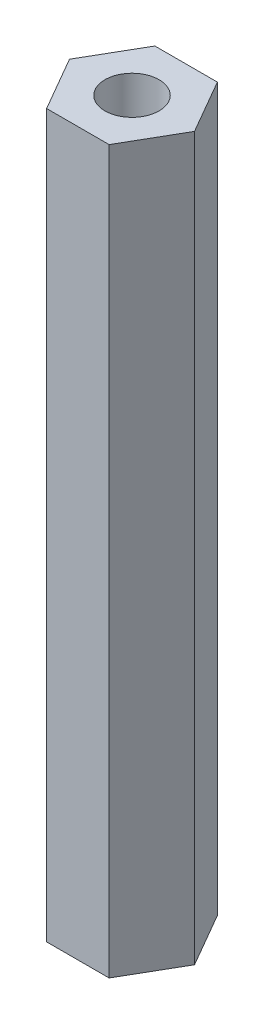
ISO-10303-21;
HEADER;
FILE_DESCRIPTION(('STEP AP214'),'2;1');
FILE_NAME('part.step','',(''),(''),'','','');
FILE_SCHEMA(('AUTOMOTIVE_DESIGN { 1 0 10303 214 1 1 1 1 }'));
ENDSEC;
DATA;
#1=APPLICATION_CONTEXT('core data for automotive mechanical design processes');
#2=APPLICATION_PROTOCOL_DEFINITION('international standard','automotive_design',2000,#1);
#3=PRODUCT_CONTEXT('',#1,'mechanical');
#4=PRODUCT('Part','Part','',(#3));
#5=PRODUCT_RELATED_PRODUCT_CATEGORY('part','',(#4));
#6=PRODUCT_DEFINITION_FORMATION('','',#4);
#7=PRODUCT_DEFINITION_CONTEXT('part definition',#1,'design');
#8=PRODUCT_DEFINITION('design','',#6,#7);
#9=PRODUCT_DEFINITION_SHAPE('','',#8);
#10=(LENGTH_UNIT() NAMED_UNIT(*) SI_UNIT(.MILLI.,.METRE.));
#11=(NAMED_UNIT(*) PLANE_ANGLE_UNIT() SI_UNIT($,.RADIAN.));
#12=(NAMED_UNIT(*) SI_UNIT($,.STERADIAN.) SOLID_ANGLE_UNIT());
#13=UNCERTAINTY_MEASURE_WITH_UNIT(LENGTH_MEASURE(1.E-05),#10,'distance_accuracy_value','');
#14=(GEOMETRIC_REPRESENTATION_CONTEXT(3) GLOBAL_UNCERTAINTY_ASSIGNED_CONTEXT((#13)) GLOBAL_UNIT_ASSIGNED_CONTEXT((#10,
#11,#12)) REPRESENTATION_CONTEXT('',''));
#15=CARTESIAN_POINT('',(0.,0.,0.));
#16=DIRECTION('',(0.,0.,1.));
#17=DIRECTION('',(1.,0.,0.));
#18=AXIS2_PLACEMENT_3D('',#15,#16,#17);
#19=CARTESIAN_POINT('',(1.73205080756888,20.,3.00000000000001));
#20=DIRECTION('',(-0.866025403784439,0.,-0.5));
#21=DIRECTION('',(-0.5,0.,0.866025403784439));
#22=AXIS2_PLACEMENT_3D('',#19,#20,#21);
#23=PLANE('',#22);
#24=DIRECTION('',(0.5,0.,-0.866025403784439));
#25=VECTOR('',#24,1.);
#26=CARTESIAN_POINT('',(1.73205080756888,-20.,3.00000000000001));
#27=LINE('',#26,#25);
#28=CARTESIAN_POINT('',(1.73205080756888,-20.,3.00000000000001));
#29=VERTEX_POINT('',#28);
#30=CARTESIAN_POINT('',(3.46410161513776,-20.,0.));
#31=VERTEX_POINT('',#30);
#32=EDGE_CURVE('E132',#29,#31,#27,.T.);
#33=ORIENTED_EDGE('',*,*,#32,.T.);
#34=DIRECTION('',(0.,-1.,0.));
#35=VECTOR('',#34,1.);
#36=CARTESIAN_POINT('',(3.46410161513776,20.,0.));
#37=LINE('',#36,#35);
#38=CARTESIAN_POINT('',(3.46410161513776,20.,0.));
#39=VERTEX_POINT('',#38);
#40=EDGE_CURVE('E11',#39,#31,#37,.T.);
#41=ORIENTED_EDGE('',*,*,#40,.F.);
#42=DIRECTION('',(0.5,0.,-0.866025403784439));
#43=VECTOR('',#42,1.);
#44=CARTESIAN_POINT('',(1.73205080756888,20.,3.00000000000001));
#45=LINE('',#44,#43);
#46=CARTESIAN_POINT('',(1.73205080756888,20.,3.00000000000001));
#47=VERTEX_POINT('',#46);
#48=EDGE_CURVE('E149',#47,#39,#45,.T.);
#49=ORIENTED_EDGE('',*,*,#48,.F.);
#50=DIRECTION('',(0.,-1.,0.));
#51=VECTOR('',#50,1.);
#52=CARTESIAN_POINT('',(1.73205080756888,20.,3.00000000000001));
#53=LINE('',#52,#51);
#54=EDGE_CURVE('E128',#47,#29,#53,.T.);
#55=ORIENTED_EDGE('',*,*,#54,.T.);
#56=EDGE_LOOP('',(#33,#41,#49,#55));
#57=FACE_BOUND('',#56,.T.);
#58=ADVANCED_FACE('F43',(#57),#23,.F.);
#59=CARTESIAN_POINT('',(3.46410161513776,20.,0.));
#60=DIRECTION('',(-0.866025403784439,0.,0.5));
#61=DIRECTION('',(0.5,0.,0.866025403784439));
#62=AXIS2_PLACEMENT_3D('',#59,#60,#61);
#63=PLANE('',#62);
#64=DIRECTION('',(-0.5,0.,-0.866025403784439));
#65=VECTOR('',#64,1.);
#66=CARTESIAN_POINT('',(3.46410161513776,-20.,0.));
#67=LINE('',#66,#65);
#68=CARTESIAN_POINT('',(1.73205080756886,-20.,-3.00000000000003));
#69=VERTEX_POINT('',#68);
#70=EDGE_CURVE('E136',#31,#69,#67,.T.);
#71=ORIENTED_EDGE('',*,*,#70,.T.);
#72=DIRECTION('',(0.,-1.,0.));
#73=VECTOR('',#72,1.);
#74=CARTESIAN_POINT('',(1.73205080756886,20.,-3.00000000000003));
#75=LINE('',#74,#73);
#76=CARTESIAN_POINT('',(1.73205080756886,20.,-3.00000000000003));
#77=VERTEX_POINT('',#76);
#78=EDGE_CURVE('E52',#77,#69,#75,.T.);
#79=ORIENTED_EDGE('',*,*,#78,.F.);
#80=DIRECTION('',(-0.5,0.,-0.866025403784439));
#81=VECTOR('',#80,1.);
#82=CARTESIAN_POINT('',(3.46410161513776,20.,0.));
#83=LINE('',#82,#81);
#84=EDGE_CURVE('E97',#39,#77,#83,.T.);
#85=ORIENTED_EDGE('',*,*,#84,.F.);
#86=ORIENTED_EDGE('',*,*,#40,.T.);
#87=EDGE_LOOP('',(#71,#79,#85,#86));
#88=FACE_BOUND('',#87,.T.);
#89=ADVANCED_FACE('F178',(#88),#63,.F.);
#90=CARTESIAN_POINT('',(1.73205080756886,20.,-3.00000000000003));
#91=DIRECTION('',(0.,0.,1.));
#92=DIRECTION('',(1.,0.,0.));
#93=AXIS2_PLACEMENT_3D('',#90,#91,#92);
#94=PLANE('',#93);
#95=DIRECTION('',(-1.,0.,0.));
#96=VECTOR('',#95,1.);
#97=CARTESIAN_POINT('',(1.73205080756886,-20.,-3.00000000000003));
#98=LINE('',#97,#96);
#99=CARTESIAN_POINT('',(-1.73205080756889,-20.,-3.00000000000003));
#100=VERTEX_POINT('',#99);
#101=EDGE_CURVE('E140',#69,#100,#98,.T.);
#102=ORIENTED_EDGE('',*,*,#101,.T.);
#103=DIRECTION('',(0.,-1.,0.));
#104=VECTOR('',#103,1.);
#105=CARTESIAN_POINT('',(-1.73205080756889,20.,-3.00000000000003));
#106=LINE('',#105,#104);
#107=CARTESIAN_POINT('',(-1.73205080756889,20.,-3.00000000000003));
#108=VERTEX_POINT('',#107);
#109=EDGE_CURVE('E121',#108,#100,#106,.T.);
#110=ORIENTED_EDGE('',*,*,#109,.F.);
#111=DIRECTION('',(-1.,0.,0.));
#112=VECTOR('',#111,1.);
#113=CARTESIAN_POINT('',(1.73205080756886,20.,-3.00000000000003));
#114=LINE('',#113,#112);
#115=EDGE_CURVE('E110',#77,#108,#114,.T.);
#116=ORIENTED_EDGE('',*,*,#115,.F.);
#117=ORIENTED_EDGE('',*,*,#78,.T.);
#118=EDGE_LOOP('',(#102,#110,#116,#117));
#119=FACE_BOUND('',#118,.T.);
#120=ADVANCED_FACE('F159',(#119),#94,.F.);
#121=CARTESIAN_POINT('',(-1.73205080756889,20.,-3.00000000000003));
#122=DIRECTION('',(0.866025403784439,0.,0.499999999999999));
#123=DIRECTION('',(0.499999999999999,0.,-0.866025403784439));
#124=AXIS2_PLACEMENT_3D('',#121,#122,#123);
#125=PLANE('',#124);
#126=DIRECTION('',(-0.499999999999999,0.,0.866025403784439));
#127=VECTOR('',#126,1.);
#128=CARTESIAN_POINT('',(-1.73205080756889,-20.,-3.00000000000003));
#129=LINE('',#128,#127);
#130=CARTESIAN_POINT('',(-3.46410161513777,-20.,0.));
#131=VERTEX_POINT('',#130);
#132=EDGE_CURVE('E119',#100,#131,#129,.T.);
#133=ORIENTED_EDGE('',*,*,#132,.T.);
#134=DIRECTION('',(0.,-1.,0.));
#135=VECTOR('',#134,1.);
#136=CARTESIAN_POINT('',(-3.46410161513777,20.,0.));
#137=LINE('',#136,#135);
#138=CARTESIAN_POINT('',(-3.46410161513777,20.,0.));
#139=VERTEX_POINT('',#138);
#140=EDGE_CURVE('E116',#139,#131,#137,.T.);
#141=ORIENTED_EDGE('',*,*,#140,.F.);
#142=DIRECTION('',(-0.499999999999999,0.,0.866025403784439));
#143=VECTOR('',#142,1.);
#144=CARTESIAN_POINT('',(-1.73205080756889,20.,-3.00000000000003));
#145=LINE('',#144,#143);
#146=EDGE_CURVE('E104',#108,#139,#145,.T.);
#147=ORIENTED_EDGE('',*,*,#146,.F.);
#148=ORIENTED_EDGE('',*,*,#109,.T.);
#149=EDGE_LOOP('',(#133,#141,#147,#148));
#150=FACE_BOUND('',#149,.T.);
#151=ADVANCED_FACE('F117',(#150),#125,.F.);
#152=CARTESIAN_POINT('',(-3.46410161513777,20.,0.));
#153=DIRECTION('',(0.86602540378444,0.,-0.499999999999998));
#154=DIRECTION('',(-0.499999999999998,0.,-0.86602540378444));
#155=AXIS2_PLACEMENT_3D('',#152,#153,#154);
#156=PLANE('',#155);
#157=DIRECTION('',(0.499999999999998,0.,0.86602540378444));
#158=VECTOR('',#157,1.);
#159=CARTESIAN_POINT('',(-3.46410161513777,-20.,0.));
#160=LINE('',#159,#158);
#161=CARTESIAN_POINT('',(-1.73205080756889,-20.,3.00000000000002));
#162=VERTEX_POINT('',#161);
#163=EDGE_CURVE('E83',#131,#162,#160,.T.);
#164=ORIENTED_EDGE('',*,*,#163,.T.);
#165=DIRECTION('',(0.,-1.,0.));
#166=VECTOR('',#165,1.);
#167=CARTESIAN_POINT('',(-1.73205080756889,20.,3.00000000000002));
#168=LINE('',#167,#166);
#169=CARTESIAN_POINT('',(-1.73205080756889,20.,3.00000000000002));
#170=VERTEX_POINT('',#169);
#171=EDGE_CURVE('E122',#170,#162,#168,.T.);
#172=ORIENTED_EDGE('',*,*,#171,.F.);
#173=DIRECTION('',(0.499999999999998,0.,0.86602540378444));
#174=VECTOR('',#173,1.);
#175=CARTESIAN_POINT('',(-3.46410161513777,20.,0.));
#176=LINE('',#175,#174);
#177=EDGE_CURVE('E108',#139,#170,#176,.T.);
#178=ORIENTED_EDGE('',*,*,#177,.F.);
#179=ORIENTED_EDGE('',*,*,#140,.T.);
#180=EDGE_LOOP('',(#164,#172,#178,#179));
#181=FACE_BOUND('',#180,.T.);
#182=ADVANCED_FACE('F124',(#181),#156,.F.);
#183=CARTESIAN_POINT('',(-1.73205080756889,20.,3.00000000000002));
#184=DIRECTION('',(0.,0.,-1.));
#185=DIRECTION('',(-1.,0.,0.));
#186=AXIS2_PLACEMENT_3D('',#183,#184,#185);
#187=PLANE('',#186);
#188=DIRECTION('',(1.,0.,0.));
#189=VECTOR('',#188,1.);
#190=CARTESIAN_POINT('',(-1.73205080756889,-20.,3.00000000000002));
#191=LINE('',#190,#189);
#192=EDGE_CURVE('E89',#162,#29,#191,.T.);
#193=ORIENTED_EDGE('',*,*,#192,.T.);
#194=ORIENTED_EDGE('',*,*,#54,.F.);
#195=DIRECTION('',(1.,0.,0.));
#196=VECTOR('',#195,1.);
#197=CARTESIAN_POINT('',(-1.73205080756889,20.,3.00000000000002));
#198=LINE('',#197,#196);
#199=EDGE_CURVE('E60',#170,#47,#198,.T.);
#200=ORIENTED_EDGE('',*,*,#199,.F.);
#201=ORIENTED_EDGE('',*,*,#171,.T.);
#202=EDGE_LOOP('',(#193,#194,#200,#201));
#203=FACE_BOUND('',#202,.T.);
#204=ADVANCED_FACE('F166',(#203),#187,.F.);
#205=CARTESIAN_POINT('',(0.,20.,0.));
#206=DIRECTION('',(0.,1.,0.));
#207=DIRECTION('',(0.,0.,1.));
#208=AXIS2_PLACEMENT_3D('',#205,#206,#207);
#209=PLANE('',#208);
#210=CARTESIAN_POINT('',(0.,20.,0.));
#211=DIRECTION('',(0.,1.,0.));
#212=DIRECTION('',(0.,0.,1.));
#213=AXIS2_PLACEMENT_3D('',#210,#211,#212);
#214=CIRCLE('',#213,1.5);
#215=CARTESIAN_POINT('',(0.,20.,1.5));
#216=VERTEX_POINT('',#215);
#217=EDGE_CURVE('E300',#216,#216,#214,.T.);
#218=ORIENTED_EDGE('',*,*,#217,.F.);
#219=EDGE_LOOP('',(#218));
#220=FACE_BOUND('',#219,.T.);
#221=ORIENTED_EDGE('',*,*,#48,.T.);
#222=ORIENTED_EDGE('',*,*,#84,.T.);
#223=ORIENTED_EDGE('',*,*,#115,.T.);
#224=ORIENTED_EDGE('',*,*,#146,.T.);
#225=ORIENTED_EDGE('',*,*,#177,.T.);
#226=ORIENTED_EDGE('',*,*,#199,.T.);
#227=EDGE_LOOP('',(#221,#222,#223,#224,#225,#226));
#228=FACE_BOUND('',#227,.T.);
#229=ADVANCED_FACE('F106',(#220,#228),#209,.T.);
#230=CARTESIAN_POINT('',(0.,-20.,0.));
#231=DIRECTION('',(0.,1.,0.));
#232=DIRECTION('',(0.,0.,1.));
#233=AXIS2_PLACEMENT_3D('',#230,#231,#232);
#234=PLANE('',#233);
#235=CARTESIAN_POINT('',(0.,-20.,0.));
#236=DIRECTION('',(0.,1.,0.));
#237=DIRECTION('',(0.,0.,1.));
#238=AXIS2_PLACEMENT_3D('',#235,#236,#237);
#239=CIRCLE('',#238,1.5);
#240=CARTESIAN_POINT('',(0.,-20.,1.5));
#241=VERTEX_POINT('',#240);
#242=EDGE_CURVE('E301',#241,#241,#239,.T.);
#243=ORIENTED_EDGE('',*,*,#242,.T.);
#244=EDGE_LOOP('',(#243));
#245=FACE_BOUND('',#244,.T.);
#246=ORIENTED_EDGE('',*,*,#32,.F.);
#247=ORIENTED_EDGE('',*,*,#192,.F.);
#248=ORIENTED_EDGE('',*,*,#163,.F.);
#249=ORIENTED_EDGE('',*,*,#132,.F.);
#250=ORIENTED_EDGE('',*,*,#101,.F.);
#251=ORIENTED_EDGE('',*,*,#70,.F.);
#252=EDGE_LOOP('',(#246,#247,#248,#249,#250,#251));
#253=FACE_BOUND('',#252,.T.);
#254=ADVANCED_FACE('F162',(#245,#253),#234,.F.);
#255=CARTESIAN_POINT('',(0.,14.,0.));
#256=DIRECTION('',(0.,1.,0.));
#257=DIRECTION('',(0.,0.,1.));
#258=AXIS2_PLACEMENT_3D('',#255,#256,#257);
#259=CYLINDRICAL_SURFACE('',#258,1.5);
#260=CARTESIAN_POINT('',(0.,14.,0.));
#261=DIRECTION('',(0.,1.,0.));
#262=DIRECTION('',(0.,0.,1.));
#263=AXIS2_PLACEMENT_3D('',#260,#261,#262);
#264=CIRCLE('',#263,1.5);
#265=CARTESIAN_POINT('',(0.,14.,1.5));
#266=VERTEX_POINT('',#265);
#267=EDGE_CURVE('E137',#266,#266,#264,.T.);
#268=ORIENTED_EDGE('',*,*,#267,.F.);
#269=EDGE_LOOP('',(#268));
#270=FACE_BOUND('',#269,.T.);
#271=ORIENTED_EDGE('',*,*,#217,.T.);
#272=EDGE_LOOP('',(#271));
#273=FACE_BOUND('',#272,.T.);
#274=ADVANCED_FACE('F216',(#270,#273),#259,.F.);
#275=CARTESIAN_POINT('',(0.,14.,0.));
#276=DIRECTION('',(0.,1.,0.));
#277=DIRECTION('',(0.,0.,1.));
#278=AXIS2_PLACEMENT_3D('',#275,#276,#277);
#279=PLANE('',#278);
#280=ORIENTED_EDGE('',*,*,#267,.T.);
#281=EDGE_LOOP('',(#280));
#282=FACE_BOUND('',#281,.T.);
#283=ADVANCED_FACE('F221',(#282),#279,.T.);
#284=CARTESIAN_POINT('',(0.,-14.,0.));
#285=DIRECTION('',(0.,-1.,0.));
#286=DIRECTION('',(0.,0.,-1.));
#287=AXIS2_PLACEMENT_3D('',#284,#285,#286);
#288=CYLINDRICAL_SURFACE('',#287,1.5);
#289=CARTESIAN_POINT('',(0.,-14.,0.));
#290=DIRECTION('',(0.,1.,0.));
#291=DIRECTION('',(0.,0.,1.));
#292=AXIS2_PLACEMENT_3D('',#289,#290,#291);
#293=CIRCLE('',#292,1.5);
#294=CARTESIAN_POINT('',(0.,-14.,1.5));
#295=VERTEX_POINT('',#294);
#296=EDGE_CURVE('E298',#295,#295,#293,.T.);
#297=ORIENTED_EDGE('',*,*,#296,.T.);
#298=EDGE_LOOP('',(#297));
#299=FACE_BOUND('',#298,.T.);
#300=ORIENTED_EDGE('',*,*,#242,.F.);
#301=EDGE_LOOP('',(#300));
#302=FACE_BOUND('',#301,.T.);
#303=ADVANCED_FACE('F232',(#299,#302),#288,.F.);
#304=CARTESIAN_POINT('',(0.,-14.,0.));
#305=DIRECTION('',(0.,-1.,0.));
#306=DIRECTION('',(0.,0.,1.));
#307=AXIS2_PLACEMENT_3D('',#304,#305,#306);
#308=PLANE('',#307);
#309=ORIENTED_EDGE('',*,*,#296,.F.);
#310=EDGE_LOOP('',(#309));
#311=FACE_BOUND('',#310,.T.);
#312=ADVANCED_FACE('F250',(#311),#308,.T.);
#313=CLOSED_SHELL('',(#58,#89,#120,#151,#182,#204,#229,#254,#274,#283,#303,#312));
#314=MANIFOLD_SOLID_BREP('B2',#313);
#315=ADVANCED_BREP_SHAPE_REPRESENTATION('',(#18,#314),#14);
#316=SHAPE_DEFINITION_REPRESENTATION(#9,#315);
ENDSEC;
END-ISO-10303-21;
